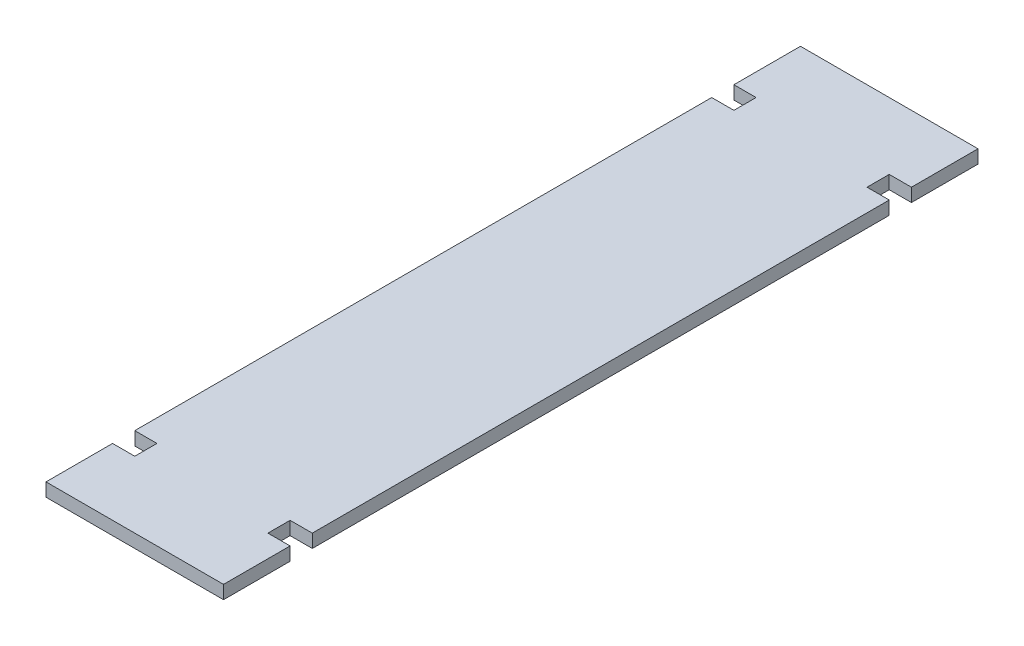
ISO-10303-21;
HEADER;
FILE_DESCRIPTION(('STEP AP214'),'2;1');
FILE_NAME('part.step','',(''),(''),'','','');
FILE_SCHEMA(('AUTOMOTIVE_DESIGN { 1 0 10303 214 1 1 1 1 }'));
ENDSEC;
DATA;
#1=APPLICATION_CONTEXT('core data for automotive mechanical design processes');
#2=APPLICATION_PROTOCOL_DEFINITION('international standard','automotive_design',2000,#1);
#3=PRODUCT_CONTEXT('',#1,'mechanical');
#4=PRODUCT('Part','Part','',(#3));
#5=PRODUCT_RELATED_PRODUCT_CATEGORY('part','',(#4));
#6=PRODUCT_DEFINITION_FORMATION('','',#4);
#7=PRODUCT_DEFINITION_CONTEXT('part definition',#1,'design');
#8=PRODUCT_DEFINITION('design','',#6,#7);
#9=PRODUCT_DEFINITION_SHAPE('','',#8);
#10=(LENGTH_UNIT() NAMED_UNIT(*) SI_UNIT(.MILLI.,.METRE.));
#11=(NAMED_UNIT(*) PLANE_ANGLE_UNIT() SI_UNIT($,.RADIAN.));
#12=(NAMED_UNIT(*) SI_UNIT($,.STERADIAN.) SOLID_ANGLE_UNIT());
#13=UNCERTAINTY_MEASURE_WITH_UNIT(LENGTH_MEASURE(1.E-05),#10,'distance_accuracy_value','');
#14=(GEOMETRIC_REPRESENTATION_CONTEXT(3) GLOBAL_UNCERTAINTY_ASSIGNED_CONTEXT((#13)) GLOBAL_UNIT_ASSIGNED_CONTEXT((#10,
#11,#12)) REPRESENTATION_CONTEXT('',''));
#15=CARTESIAN_POINT('',(0.,0.,0.));
#16=DIRECTION('',(0.,0.,1.));
#17=DIRECTION('',(1.,0.,0.));
#18=AXIS2_PLACEMENT_3D('',#15,#16,#17);
#19=CARTESIAN_POINT('',(0.,3.,0.));
#20=DIRECTION('',(1.,0.,0.));
#21=DIRECTION('',(0.,0.,-1.));
#22=AXIS2_PLACEMENT_3D('',#19,#20,#21);
#23=PLANE('',#22);
#24=DIRECTION('',(0.,-1.,0.));
#25=VECTOR('',#24,1.);
#26=CARTESIAN_POINT('',(0.,10.,-15.));
#27=LINE('',#26,#25);
#28=CARTESIAN_POINT('',(0.,3.,-15.));
#29=VERTEX_POINT('',#28);
#30=CARTESIAN_POINT('',(0.,0.,-15.));
#31=VERTEX_POINT('',#30);
#32=EDGE_CURVE('E199',#29,#31,#27,.T.);
#33=ORIENTED_EDGE('',*,*,#32,.T.);
#34=DIRECTION('',(0.,0.,1.));
#35=VECTOR('',#34,1.);
#36=CARTESIAN_POINT('',(0.,0.,0.));
#37=LINE('',#36,#35);
#38=CARTESIAN_POINT('',(0.,0.,0.));
#39=VERTEX_POINT('',#38);
#40=EDGE_CURVE('E229',#31,#39,#37,.T.);
#41=ORIENTED_EDGE('',*,*,#40,.T.);
#42=DIRECTION('',(0.,-1.,0.));
#43=VECTOR('',#42,1.);
#44=CARTESIAN_POINT('',(0.,3.,0.));
#45=LINE('',#44,#43);
#46=CARTESIAN_POINT('',(0.,3.,0.));
#47=VERTEX_POINT('',#46);
#48=EDGE_CURVE('E11',#47,#39,#45,.T.);
#49=ORIENTED_EDGE('',*,*,#48,.F.);
#50=DIRECTION('',(0.,0.,1.));
#51=VECTOR('',#50,1.);
#52=CARTESIAN_POINT('',(0.,3.,0.));
#53=LINE('',#52,#51);
#54=EDGE_CURVE('E211',#29,#47,#53,.T.);
#55=ORIENTED_EDGE('',*,*,#54,.F.);
#56=EDGE_LOOP('',(#33,#41,#49,#55));
#57=FACE_BOUND('',#56,.T.);
#58=ADVANCED_FACE('F39',(#57),#23,.F.);
#59=DIRECTION('',(0.,-1.,0.));
#60=VECTOR('',#59,1.);
#61=CARTESIAN_POINT('',(0.,10.,-20.));
#62=LINE('',#61,#60);
#63=CARTESIAN_POINT('',(0.,3.,-20.));
#64=VERTEX_POINT('',#63);
#65=CARTESIAN_POINT('',(0.,0.,-20.));
#66=VERTEX_POINT('',#65);
#67=EDGE_CURVE('E343',#64,#66,#62,.T.);
#68=ORIENTED_EDGE('',*,*,#67,.F.);
#69=CARTESIAN_POINT('',(0.,3.,-150.));
#70=VERTEX_POINT('',#69);
#71=EDGE_CURVE('E247',#70,#64,#53,.T.);
#72=ORIENTED_EDGE('',*,*,#71,.F.);
#73=DIRECTION('',(0.,-1.,0.));
#74=VECTOR('',#73,1.);
#75=CARTESIAN_POINT('',(0.,10.,-150.));
#76=LINE('',#75,#74);
#77=CARTESIAN_POINT('',(0.,0.,-150.));
#78=VERTEX_POINT('',#77);
#79=EDGE_CURVE('E291',#70,#78,#76,.T.);
#80=ORIENTED_EDGE('',*,*,#79,.T.);
#81=EDGE_CURVE('E227',#78,#66,#37,.T.);
#82=ORIENTED_EDGE('',*,*,#81,.T.);
#83=EDGE_LOOP('',(#68,#72,#80,#82));
#84=FACE_BOUND('',#83,.T.);
#85=ADVANCED_FACE('F423',(#84),#23,.F.);
#86=CARTESIAN_POINT('',(0.,0.,-170.));
#87=VERTEX_POINT('',#86);
#88=CARTESIAN_POINT('',(0.,0.,-155.));
#89=VERTEX_POINT('',#88);
#90=EDGE_CURVE('E223',#87,#89,#37,.T.);
#91=ORIENTED_EDGE('',*,*,#90,.T.);
#92=DIRECTION('',(0.,-1.,0.));
#93=VECTOR('',#92,1.);
#94=CARTESIAN_POINT('',(0.,10.,-155.));
#95=LINE('',#94,#93);
#96=CARTESIAN_POINT('',(0.,3.,-155.));
#97=VERTEX_POINT('',#96);
#98=EDGE_CURVE('E288',#97,#89,#95,.T.);
#99=ORIENTED_EDGE('',*,*,#98,.F.);
#100=CARTESIAN_POINT('',(0.,3.,-170.));
#101=VERTEX_POINT('',#100);
#102=EDGE_CURVE('E243',#101,#97,#53,.T.);
#103=ORIENTED_EDGE('',*,*,#102,.F.);
#104=DIRECTION('',(0.,-1.,0.));
#105=VECTOR('',#104,1.);
#106=CARTESIAN_POINT('',(0.,3.,-170.));
#107=LINE('',#106,#105);
#108=EDGE_CURVE('E234',#101,#87,#107,.T.);
#109=ORIENTED_EDGE('',*,*,#108,.T.);
#110=EDGE_LOOP('',(#91,#99,#103,#109));
#111=FACE_BOUND('',#110,.T.);
#112=ADVANCED_FACE('F406',(#111),#23,.F.);
#113=CARTESIAN_POINT('',(40.,3.,0.));
#114=DIRECTION('',(-1.,0.,0.));
#115=DIRECTION('',(0.,0.,1.));
#116=AXIS2_PLACEMENT_3D('',#113,#114,#115);
#117=PLANE('',#116);
#118=DIRECTION('',(0.,-1.,0.));
#119=VECTOR('',#118,1.);
#120=CARTESIAN_POINT('',(39.9999999999999,10.,-150.));
#121=LINE('',#120,#119);
#122=CARTESIAN_POINT('',(39.9999999999999,3.,-150.));
#123=VERTEX_POINT('',#122);
#124=CARTESIAN_POINT('',(39.9999999999999,0.,-150.));
#125=VERTEX_POINT('',#124);
#126=EDGE_CURVE('E315',#123,#125,#121,.T.);
#127=ORIENTED_EDGE('',*,*,#126,.F.);
#128=DIRECTION('',(0.,0.,-1.));
#129=VECTOR('',#128,1.);
#130=CARTESIAN_POINT('',(40.,3.,0.));
#131=LINE('',#130,#129);
#132=CARTESIAN_POINT('',(40.,3.,-20.));
#133=VERTEX_POINT('',#132);
#134=EDGE_CURVE('E238',#133,#123,#131,.T.);
#135=ORIENTED_EDGE('',*,*,#134,.F.);
#136=DIRECTION('',(0.,-1.,0.));
#137=VECTOR('',#136,1.);
#138=CARTESIAN_POINT('',(40.,10.,-20.));
#139=LINE('',#138,#137);
#140=CARTESIAN_POINT('',(40.,0.,-20.));
#141=VERTEX_POINT('',#140);
#142=EDGE_CURVE('E186',#133,#141,#139,.T.);
#143=ORIENTED_EDGE('',*,*,#142,.T.);
#144=DIRECTION('',(0.,0.,-1.));
#145=VECTOR('',#144,1.);
#146=CARTESIAN_POINT('',(40.,0.,0.));
#147=LINE('',#146,#145);
#148=EDGE_CURVE('E206',#141,#125,#147,.T.);
#149=ORIENTED_EDGE('',*,*,#148,.T.);
#150=EDGE_LOOP('',(#127,#135,#143,#149));
#151=FACE_BOUND('',#150,.T.);
#152=ADVANCED_FACE('F376',(#151),#117,.F.);
#153=DIRECTION('',(0.,-1.,0.));
#154=VECTOR('',#153,1.);
#155=CARTESIAN_POINT('',(40.,10.,-155.));
#156=LINE('',#155,#154);
#157=CARTESIAN_POINT('',(40.,3.,-155.));
#158=VERTEX_POINT('',#157);
#159=CARTESIAN_POINT('',(40.,0.,-155.));
#160=VERTEX_POINT('',#159);
#161=EDGE_CURVE('E318',#158,#160,#156,.T.);
#162=ORIENTED_EDGE('',*,*,#161,.T.);
#163=CARTESIAN_POINT('',(40.,0.,-170.));
#164=VERTEX_POINT('',#163);
#165=EDGE_CURVE('E208',#160,#164,#147,.T.);
#166=ORIENTED_EDGE('',*,*,#165,.T.);
#167=DIRECTION('',(0.,-1.,0.));
#168=VECTOR('',#167,1.);
#169=CARTESIAN_POINT('',(40.,3.,-170.));
#170=LINE('',#169,#168);
#171=CARTESIAN_POINT('',(40.,3.,-170.));
#172=VERTEX_POINT('',#171);
#173=EDGE_CURVE('E392',#172,#164,#170,.T.);
#174=ORIENTED_EDGE('',*,*,#173,.F.);
#175=EDGE_CURVE('E239',#158,#172,#131,.T.);
#176=ORIENTED_EDGE('',*,*,#175,.F.);
#177=EDGE_LOOP('',(#162,#166,#174,#176));
#178=FACE_BOUND('',#177,.T.);
#179=ADVANCED_FACE('F393',(#178),#117,.F.);
#180=CARTESIAN_POINT('',(40.,0.,0.));
#181=VERTEX_POINT('',#180);
#182=CARTESIAN_POINT('',(40.,0.,-15.));
#183=VERTEX_POINT('',#182);
#184=EDGE_CURVE('E193',#181,#183,#147,.T.);
#185=ORIENTED_EDGE('',*,*,#184,.T.);
#186=DIRECTION('',(0.,-1.,0.));
#187=VECTOR('',#186,1.);
#188=CARTESIAN_POINT('',(40.,10.,-15.));
#189=LINE('',#188,#187);
#190=CARTESIAN_POINT('',(40.,3.,-15.));
#191=VERTEX_POINT('',#190);
#192=EDGE_CURVE('E176',#191,#183,#189,.T.);
#193=ORIENTED_EDGE('',*,*,#192,.F.);
#194=CARTESIAN_POINT('',(40.,3.,0.));
#195=VERTEX_POINT('',#194);
#196=EDGE_CURVE('E235',#195,#191,#131,.T.);
#197=ORIENTED_EDGE('',*,*,#196,.F.);
#198=DIRECTION('',(0.,-1.,0.));
#199=VECTOR('',#198,1.);
#200=CARTESIAN_POINT('',(40.,3.,0.));
#201=LINE('',#200,#199);
#202=EDGE_CURVE('E47',#195,#181,#201,.T.);
#203=ORIENTED_EDGE('',*,*,#202,.T.);
#204=EDGE_LOOP('',(#185,#193,#197,#203));
#205=FACE_BOUND('',#204,.T.);
#206=ADVANCED_FACE('F202',(#205),#117,.F.);
#207=CARTESIAN_POINT('',(0.,3.,0.));
#208=DIRECTION('',(0.,-1.,0.));
#209=DIRECTION('',(0.,0.,-1.));
#210=AXIS2_PLACEMENT_3D('',#207,#208,#209);
#211=PLANE('',#210);
#212=DIRECTION('',(1.,0.,0.));
#213=VECTOR('',#212,1.);
#214=CARTESIAN_POINT('',(0.,3.,-150.));
#215=LINE('',#214,#213);
#216=CARTESIAN_POINT('',(35.,3.,-150.));
#217=VERTEX_POINT('',#216);
#218=EDGE_CURVE('E251',#217,#123,#215,.T.);
#219=ORIENTED_EDGE('',*,*,#218,.F.);
#220=DIRECTION('',(0.,0.,1.));
#221=VECTOR('',#220,1.);
#222=CARTESIAN_POINT('',(35.,3.,0.));
#223=LINE('',#222,#221);
#224=CARTESIAN_POINT('',(35.,3.,-155.));
#225=VERTEX_POINT('',#224);
#226=EDGE_CURVE('E248',#225,#217,#223,.T.);
#227=ORIENTED_EDGE('',*,*,#226,.F.);
#228=DIRECTION('',(-1.,0.,0.));
#229=VECTOR('',#228,1.);
#230=CARTESIAN_POINT('',(0.,3.,-155.));
#231=LINE('',#230,#229);
#232=EDGE_CURVE('E254',#158,#225,#231,.T.);
#233=ORIENTED_EDGE('',*,*,#232,.F.);
#234=ORIENTED_EDGE('',*,*,#175,.T.);
#235=DIRECTION('',(-1.,0.,0.));
#236=VECTOR('',#235,1.);
#237=CARTESIAN_POINT('',(0.,3.,-170.));
#238=LINE('',#237,#236);
#239=EDGE_CURVE('E231',#172,#101,#238,.T.);
#240=ORIENTED_EDGE('',*,*,#239,.T.);
#241=ORIENTED_EDGE('',*,*,#102,.T.);
#242=DIRECTION('',(1.,0.,0.));
#243=VECTOR('',#242,1.);
#244=CARTESIAN_POINT('',(0.,3.,-155.));
#245=LINE('',#244,#243);
#246=CARTESIAN_POINT('',(5.,3.,-155.));
#247=VERTEX_POINT('',#246);
#248=EDGE_CURVE('E276',#97,#247,#245,.T.);
#249=ORIENTED_EDGE('',*,*,#248,.T.);
#250=DIRECTION('',(0.,0.,1.));
#251=VECTOR('',#250,1.);
#252=CARTESIAN_POINT('',(5.00000000000003,3.,0.));
#253=LINE('',#252,#251);
#254=CARTESIAN_POINT('',(5.,3.,-150.));
#255=VERTEX_POINT('',#254);
#256=EDGE_CURVE('E284',#247,#255,#253,.T.);
#257=ORIENTED_EDGE('',*,*,#256,.T.);
#258=DIRECTION('',(-1.,0.,0.));
#259=VECTOR('',#258,1.);
#260=CARTESIAN_POINT('',(0.,3.,-150.));
#261=LINE('',#260,#259);
#262=EDGE_CURVE('E280',#255,#70,#261,.T.);
#263=ORIENTED_EDGE('',*,*,#262,.T.);
#264=ORIENTED_EDGE('',*,*,#71,.T.);
#265=DIRECTION('',(-1.,0.,0.));
#266=VECTOR('',#265,1.);
#267=CARTESIAN_POINT('',(0.,3.,-20.));
#268=LINE('',#267,#266);
#269=CARTESIAN_POINT('',(5.00000000000004,3.,-20.));
#270=VERTEX_POINT('',#269);
#271=EDGE_CURVE('E263',#270,#64,#268,.T.);
#272=ORIENTED_EDGE('',*,*,#271,.F.);
#273=DIRECTION('',(0.,0.,-1.));
#274=VECTOR('',#273,1.);
#275=CARTESIAN_POINT('',(5.00000000000004,3.,0.));
#276=LINE('',#275,#274);
#277=CARTESIAN_POINT('',(5.00000000000004,3.,-15.));
#278=VERTEX_POINT('',#277);
#279=EDGE_CURVE('E260',#278,#270,#276,.T.);
#280=ORIENTED_EDGE('',*,*,#279,.F.);
#281=DIRECTION('',(1.,0.,0.));
#282=VECTOR('',#281,1.);
#283=CARTESIAN_POINT('',(0.,3.,-15.));
#284=LINE('',#283,#282);
#285=EDGE_CURVE('E257',#29,#278,#284,.T.);
#286=ORIENTED_EDGE('',*,*,#285,.F.);
#287=ORIENTED_EDGE('',*,*,#54,.T.);
#288=DIRECTION('',(1.,0.,0.));
#289=VECTOR('',#288,1.);
#290=CARTESIAN_POINT('',(0.,3.,0.));
#291=LINE('',#290,#289);
#292=EDGE_CURVE('E240',#47,#195,#291,.T.);
#293=ORIENTED_EDGE('',*,*,#292,.T.);
#294=ORIENTED_EDGE('',*,*,#196,.T.);
#295=DIRECTION('',(-1.,0.,0.));
#296=VECTOR('',#295,1.);
#297=CARTESIAN_POINT('',(0.,3.,-14.9999999999998));
#298=LINE('',#297,#296);
#299=CARTESIAN_POINT('',(35.,3.,-15.));
#300=VERTEX_POINT('',#299);
#301=EDGE_CURVE('E179',#191,#300,#298,.T.);
#302=ORIENTED_EDGE('',*,*,#301,.T.);
#303=DIRECTION('',(0.,0.,-1.));
#304=VECTOR('',#303,1.);
#305=CARTESIAN_POINT('',(35.,3.,0.));
#306=LINE('',#305,#304);
#307=CARTESIAN_POINT('',(35.,3.,-20.));
#308=VERTEX_POINT('',#307);
#309=EDGE_CURVE('E272',#300,#308,#306,.T.);
#310=ORIENTED_EDGE('',*,*,#309,.T.);
#311=DIRECTION('',(1.,0.,0.));
#312=VECTOR('',#311,1.);
#313=CARTESIAN_POINT('',(0.,3.,-20.));
#314=LINE('',#313,#312);
#315=EDGE_CURVE('E268',#308,#133,#314,.T.);
#316=ORIENTED_EDGE('',*,*,#315,.T.);
#317=ORIENTED_EDGE('',*,*,#134,.T.);
#318=EDGE_LOOP('',(#219,#227,#233,#234,#240,#241,#249,#257,#263,#264,#272,#280,#286,#287,#293,
#294,#302,#310,#316,#317));
#319=FACE_BOUND('',#318,.T.);
#320=ADVANCED_FACE('F384',(#319),#211,.F.);
#321=CARTESIAN_POINT('',(0.,0.,0.));
#322=DIRECTION('',(0.,-1.,0.));
#323=DIRECTION('',(0.,0.,-1.));
#324=AXIS2_PLACEMENT_3D('',#321,#322,#323);
#325=PLANE('',#324);
#326=DIRECTION('',(0.,0.,1.));
#327=VECTOR('',#326,1.);
#328=CARTESIAN_POINT('',(35.,0.,0.));
#329=LINE('',#328,#327);
#330=CARTESIAN_POINT('',(35.,0.,-155.));
#331=VERTEX_POINT('',#330);
#332=CARTESIAN_POINT('',(35.,0.,-150.));
#333=VERTEX_POINT('',#332);
#334=EDGE_CURVE('E54',#331,#333,#329,.T.);
#335=ORIENTED_EDGE('',*,*,#334,.T.);
#336=DIRECTION('',(1.,0.,0.));
#337=VECTOR('',#336,1.);
#338=CARTESIAN_POINT('',(0.,0.,-150.));
#339=LINE('',#338,#337);
#340=EDGE_CURVE('E328',#333,#125,#339,.T.);
#341=ORIENTED_EDGE('',*,*,#340,.T.);
#342=ORIENTED_EDGE('',*,*,#148,.F.);
#343=DIRECTION('',(1.,0.,0.));
#344=VECTOR('',#343,1.);
#345=CARTESIAN_POINT('',(0.,0.,-20.));
#346=LINE('',#345,#344);
#347=CARTESIAN_POINT('',(35.,0.,-20.));
#348=VERTEX_POINT('',#347);
#349=EDGE_CURVE('E198',#348,#141,#346,.T.);
#350=ORIENTED_EDGE('',*,*,#349,.F.);
#351=DIRECTION('',(0.,0.,-1.));
#352=VECTOR('',#351,1.);
#353=CARTESIAN_POINT('',(35.,0.,0.));
#354=LINE('',#353,#352);
#355=CARTESIAN_POINT('',(35.,0.,-15.));
#356=VERTEX_POINT('',#355);
#357=EDGE_CURVE('E196',#356,#348,#354,.T.);
#358=ORIENTED_EDGE('',*,*,#357,.F.);
#359=DIRECTION('',(-1.,0.,0.));
#360=VECTOR('',#359,1.);
#361=CARTESIAN_POINT('',(0.,0.,-14.9999999999998));
#362=LINE('',#361,#360);
#363=EDGE_CURVE('E62',#183,#356,#362,.T.);
#364=ORIENTED_EDGE('',*,*,#363,.F.);
#365=ORIENTED_EDGE('',*,*,#184,.F.);
#366=DIRECTION('',(1.,0.,0.));
#367=VECTOR('',#366,1.);
#368=CARTESIAN_POINT('',(0.,0.,0.));
#369=LINE('',#368,#367);
#370=EDGE_CURVE('E216',#39,#181,#369,.T.);
#371=ORIENTED_EDGE('',*,*,#370,.F.);
#372=ORIENTED_EDGE('',*,*,#40,.F.);
#373=DIRECTION('',(1.,0.,0.));
#374=VECTOR('',#373,1.);
#375=CARTESIAN_POINT('',(0.,0.,-15.));
#376=LINE('',#375,#374);
#377=CARTESIAN_POINT('',(5.00000000000004,0.,-15.));
#378=VERTEX_POINT('',#377);
#379=EDGE_CURVE('E314',#31,#378,#376,.T.);
#380=ORIENTED_EDGE('',*,*,#379,.T.);
#381=DIRECTION('',(0.,0.,-1.));
#382=VECTOR('',#381,1.);
#383=CARTESIAN_POINT('',(5.00000000000004,0.,0.));
#384=LINE('',#383,#382);
#385=CARTESIAN_POINT('',(5.00000000000004,0.,-20.));
#386=VERTEX_POINT('',#385);
#387=EDGE_CURVE('E350',#378,#386,#384,.T.);
#388=ORIENTED_EDGE('',*,*,#387,.T.);
#389=DIRECTION('',(-1.,0.,0.));
#390=VECTOR('',#389,1.);
#391=CARTESIAN_POINT('',(0.,0.,-20.));
#392=LINE('',#391,#390);
#393=EDGE_CURVE('E346',#386,#66,#392,.T.);
#394=ORIENTED_EDGE('',*,*,#393,.T.);
#395=ORIENTED_EDGE('',*,*,#81,.F.);
#396=DIRECTION('',(-1.,0.,0.));
#397=VECTOR('',#396,1.);
#398=CARTESIAN_POINT('',(0.,0.,-150.));
#399=LINE('',#398,#397);
#400=CARTESIAN_POINT('',(5.,0.,-150.));
#401=VERTEX_POINT('',#400);
#402=EDGE_CURVE('E306',#401,#78,#399,.T.);
#403=ORIENTED_EDGE('',*,*,#402,.F.);
#404=DIRECTION('',(0.,0.,1.));
#405=VECTOR('',#404,1.);
#406=CARTESIAN_POINT('',(5.00000000000003,0.,0.));
#407=LINE('',#406,#405);
#408=CARTESIAN_POINT('',(5.,0.,-155.));
#409=VERTEX_POINT('',#408);
#410=EDGE_CURVE('E302',#409,#401,#407,.T.);
#411=ORIENTED_EDGE('',*,*,#410,.F.);
#412=DIRECTION('',(1.,0.,0.));
#413=VECTOR('',#412,1.);
#414=CARTESIAN_POINT('',(0.,0.,-155.));
#415=LINE('',#414,#413);
#416=EDGE_CURVE('E185',#89,#409,#415,.T.);
#417=ORIENTED_EDGE('',*,*,#416,.F.);
#418=ORIENTED_EDGE('',*,*,#90,.F.);
#419=DIRECTION('',(-1.,0.,0.));
#420=VECTOR('',#419,1.);
#421=CARTESIAN_POINT('',(0.,0.,-170.));
#422=LINE('',#421,#420);
#423=EDGE_CURVE('E205',#164,#87,#422,.T.);
#424=ORIENTED_EDGE('',*,*,#423,.F.);
#425=ORIENTED_EDGE('',*,*,#165,.F.);
#426=DIRECTION('',(-1.,0.,0.));
#427=VECTOR('',#426,1.);
#428=CARTESIAN_POINT('',(0.,0.,-155.));
#429=LINE('',#428,#427);
#430=EDGE_CURVE('E324',#160,#331,#429,.T.);
#431=ORIENTED_EDGE('',*,*,#430,.T.);
#432=EDGE_LOOP('',(#335,#341,#342,#350,#358,#364,#365,#371,#372,#380,#388,#394,#395,#403,#411,
#417,#418,#424,#425,#431));
#433=FACE_BOUND('',#432,.T.);
#434=ADVANCED_FACE('F191',(#433),#325,.T.);
#435=CARTESIAN_POINT('',(0.,3.,0.));
#436=DIRECTION('',(0.,0.,-1.));
#437=DIRECTION('',(-1.,0.,0.));
#438=AXIS2_PLACEMENT_3D('',#435,#436,#437);
#439=PLANE('',#438);
#440=ORIENTED_EDGE('',*,*,#370,.T.);
#441=ORIENTED_EDGE('',*,*,#202,.F.);
#442=ORIENTED_EDGE('',*,*,#292,.F.);
#443=ORIENTED_EDGE('',*,*,#48,.T.);
#444=EDGE_LOOP('',(#440,#441,#442,#443));
#445=FACE_BOUND('',#444,.T.);
#446=ADVANCED_FACE('F434',(#445),#439,.F.);
#447=CARTESIAN_POINT('',(0.,3.,-170.));
#448=DIRECTION('',(0.,0.,1.));
#449=DIRECTION('',(1.,0.,0.));
#450=AXIS2_PLACEMENT_3D('',#447,#448,#449);
#451=PLANE('',#450);
#452=ORIENTED_EDGE('',*,*,#423,.T.);
#453=ORIENTED_EDGE('',*,*,#108,.F.);
#454=ORIENTED_EDGE('',*,*,#239,.F.);
#455=ORIENTED_EDGE('',*,*,#173,.T.);
#456=EDGE_LOOP('',(#452,#453,#454,#455));
#457=FACE_BOUND('',#456,.T.);
#458=ADVANCED_FACE('F398',(#457),#451,.F.);
#459=CARTESIAN_POINT('',(0.,10.,-155.));
#460=DIRECTION('',(0.,0.,-1.));
#461=DIRECTION('',(-1.,0.,0.));
#462=AXIS2_PLACEMENT_3D('',#459,#460,#461);
#463=PLANE('',#462);
#464=ORIENTED_EDGE('',*,*,#98,.T.);
#465=ORIENTED_EDGE('',*,*,#416,.T.);
#466=DIRECTION('',(0.,-1.,0.));
#467=VECTOR('',#466,1.);
#468=CARTESIAN_POINT('',(5.,10.,-155.));
#469=LINE('',#468,#467);
#470=EDGE_CURVE('E298',#247,#409,#469,.T.);
#471=ORIENTED_EDGE('',*,*,#470,.F.);
#472=ORIENTED_EDGE('',*,*,#248,.F.);
#473=EDGE_LOOP('',(#464,#465,#471,#472));
#474=FACE_BOUND('',#473,.T.);
#475=ADVANCED_FACE('F409',(#474),#463,.F.);
#476=CARTESIAN_POINT('',(0.,10.,-150.));
#477=DIRECTION('',(0.,0.,1.));
#478=DIRECTION('',(1.,0.,0.));
#479=AXIS2_PLACEMENT_3D('',#476,#477,#478);
#480=PLANE('',#479);
#481=DIRECTION('',(0.,-1.,0.));
#482=VECTOR('',#481,1.);
#483=CARTESIAN_POINT('',(5.,10.,-150.));
#484=LINE('',#483,#482);
#485=EDGE_CURVE('E295',#255,#401,#484,.T.);
#486=ORIENTED_EDGE('',*,*,#485,.T.);
#487=ORIENTED_EDGE('',*,*,#402,.T.);
#488=ORIENTED_EDGE('',*,*,#79,.F.);
#489=ORIENTED_EDGE('',*,*,#262,.F.);
#490=EDGE_LOOP('',(#486,#487,#488,#489));
#491=FACE_BOUND('',#490,.T.);
#492=ADVANCED_FACE('F419',(#491),#480,.F.);
#493=CARTESIAN_POINT('',(5.00000000000003,10.,0.));
#494=DIRECTION('',(1.,0.,0.));
#495=DIRECTION('',(0.,0.,-1.));
#496=AXIS2_PLACEMENT_3D('',#493,#494,#495);
#497=PLANE('',#496);
#498=ORIENTED_EDGE('',*,*,#470,.T.);
#499=ORIENTED_EDGE('',*,*,#410,.T.);
#500=ORIENTED_EDGE('',*,*,#485,.F.);
#501=ORIENTED_EDGE('',*,*,#256,.F.);
#502=EDGE_LOOP('',(#498,#499,#500,#501));
#503=FACE_BOUND('',#502,.T.);
#504=ADVANCED_FACE('F413',(#503),#497,.F.);
#505=CARTESIAN_POINT('',(0.,10.,-14.9999999999998));
#506=DIRECTION('',(0.,0.,1.));
#507=DIRECTION('',(1.,0.,0.));
#508=AXIS2_PLACEMENT_3D('',#505,#506,#507);
#509=PLANE('',#508);
#510=ORIENTED_EDGE('',*,*,#192,.T.);
#511=ORIENTED_EDGE('',*,*,#363,.T.);
#512=DIRECTION('',(0.,-1.,0.));
#513=VECTOR('',#512,1.);
#514=CARTESIAN_POINT('',(35.,10.,-15.));
#515=LINE('',#514,#513);
#516=EDGE_CURVE('E363',#300,#356,#515,.T.);
#517=ORIENTED_EDGE('',*,*,#516,.F.);
#518=ORIENTED_EDGE('',*,*,#301,.F.);
#519=EDGE_LOOP('',(#510,#511,#517,#518));
#520=FACE_BOUND('',#519,.T.);
#521=ADVANCED_FACE('F177',(#520),#509,.F.);
#522=CARTESIAN_POINT('',(0.,10.,-20.));
#523=DIRECTION('',(0.,0.,-1.));
#524=DIRECTION('',(-1.,0.,0.));
#525=AXIS2_PLACEMENT_3D('',#522,#523,#524);
#526=PLANE('',#525);
#527=DIRECTION('',(0.,-1.,0.));
#528=VECTOR('',#527,1.);
#529=CARTESIAN_POINT('',(35.,10.,-20.));
#530=LINE('',#529,#528);
#531=EDGE_CURVE('E360',#308,#348,#530,.T.);
#532=ORIENTED_EDGE('',*,*,#531,.T.);
#533=ORIENTED_EDGE('',*,*,#349,.T.);
#534=ORIENTED_EDGE('',*,*,#142,.F.);
#535=ORIENTED_EDGE('',*,*,#315,.F.);
#536=EDGE_LOOP('',(#532,#533,#534,#535));
#537=FACE_BOUND('',#536,.T.);
#538=ADVANCED_FACE('F370',(#537),#526,.F.);
#539=CARTESIAN_POINT('',(35.,10.,0.));
#540=DIRECTION('',(-1.,0.,0.));
#541=DIRECTION('',(0.,0.,1.));
#542=AXIS2_PLACEMENT_3D('',#539,#540,#541);
#543=PLANE('',#542);
#544=ORIENTED_EDGE('',*,*,#516,.T.);
#545=ORIENTED_EDGE('',*,*,#357,.T.);
#546=ORIENTED_EDGE('',*,*,#531,.F.);
#547=ORIENTED_EDGE('',*,*,#309,.F.);
#548=EDGE_LOOP('',(#544,#545,#546,#547));
#549=FACE_BOUND('',#548,.T.);
#550=ADVANCED_FACE('F534',(#549),#543,.F.);
#551=CARTESIAN_POINT('',(0.,10.,-15.));
#552=DIRECTION('',(0.,0.,-1.));
#553=DIRECTION('',(-1.,0.,0.));
#554=AXIS2_PLACEMENT_3D('',#551,#552,#553);
#555=PLANE('',#554);
#556=ORIENTED_EDGE('',*,*,#285,.T.);
#557=DIRECTION('',(0.,-1.,0.));
#558=VECTOR('',#557,1.);
#559=CARTESIAN_POINT('',(5.00000000000004,10.,-15.));
#560=LINE('',#559,#558);
#561=EDGE_CURVE('E337',#278,#378,#560,.T.);
#562=ORIENTED_EDGE('',*,*,#561,.T.);
#563=ORIENTED_EDGE('',*,*,#379,.F.);
#564=ORIENTED_EDGE('',*,*,#32,.F.);
#565=EDGE_LOOP('',(#556,#562,#563,#564));
#566=FACE_BOUND('',#565,.T.);
#567=ADVANCED_FACE('F440',(#566),#555,.T.);
#568=CARTESIAN_POINT('',(5.00000000000004,10.,0.));
#569=DIRECTION('',(-1.,0.,0.));
#570=DIRECTION('',(0.,0.,1.));
#571=AXIS2_PLACEMENT_3D('',#568,#569,#570);
#572=PLANE('',#571);
#573=ORIENTED_EDGE('',*,*,#279,.T.);
#574=DIRECTION('',(0.,-1.,0.));
#575=VECTOR('',#574,1.);
#576=CARTESIAN_POINT('',(5.00000000000004,10.,-20.));
#577=LINE('',#576,#575);
#578=EDGE_CURVE('E340',#270,#386,#577,.T.);
#579=ORIENTED_EDGE('',*,*,#578,.T.);
#580=ORIENTED_EDGE('',*,*,#387,.F.);
#581=ORIENTED_EDGE('',*,*,#561,.F.);
#582=EDGE_LOOP('',(#573,#579,#580,#581));
#583=FACE_BOUND('',#582,.T.);
#584=ADVANCED_FACE('F443',(#583),#572,.T.);
#585=CARTESIAN_POINT('',(0.,10.,-20.));
#586=DIRECTION('',(0.,0.,1.));
#587=DIRECTION('',(1.,0.,0.));
#588=AXIS2_PLACEMENT_3D('',#585,#586,#587);
#589=PLANE('',#588);
#590=ORIENTED_EDGE('',*,*,#271,.T.);
#591=ORIENTED_EDGE('',*,*,#67,.T.);
#592=ORIENTED_EDGE('',*,*,#393,.F.);
#593=ORIENTED_EDGE('',*,*,#578,.F.);
#594=EDGE_LOOP('',(#590,#591,#592,#593));
#595=FACE_BOUND('',#594,.T.);
#596=ADVANCED_FACE('F447',(#595),#589,.T.);
#597=CARTESIAN_POINT('',(35.,10.,0.));
#598=DIRECTION('',(1.,0.,0.));
#599=DIRECTION('',(0.,0.,-1.));
#600=AXIS2_PLACEMENT_3D('',#597,#598,#599);
#601=PLANE('',#600);
#602=ORIENTED_EDGE('',*,*,#226,.T.);
#603=DIRECTION('',(0.,-1.,0.));
#604=VECTOR('',#603,1.);
#605=CARTESIAN_POINT('',(35.,10.,-150.));
#606=LINE('',#605,#604);
#607=EDGE_CURVE('E311',#217,#333,#606,.T.);
#608=ORIENTED_EDGE('',*,*,#607,.T.);
#609=ORIENTED_EDGE('',*,*,#334,.F.);
#610=DIRECTION('',(0.,-1.,0.));
#611=VECTOR('',#610,1.);
#612=CARTESIAN_POINT('',(35.,10.,-155.));
#613=LINE('',#612,#611);
#614=EDGE_CURVE('E321',#225,#331,#613,.T.);
#615=ORIENTED_EDGE('',*,*,#614,.F.);
#616=EDGE_LOOP('',(#602,#608,#609,#615));
#617=FACE_BOUND('',#616,.T.);
#618=ADVANCED_FACE('F449',(#617),#601,.T.);
#619=CARTESIAN_POINT('',(0.,10.,-150.));
#620=DIRECTION('',(0.,0.,-1.));
#621=DIRECTION('',(-1.,0.,0.));
#622=AXIS2_PLACEMENT_3D('',#619,#620,#621);
#623=PLANE('',#622);
#624=ORIENTED_EDGE('',*,*,#218,.T.);
#625=ORIENTED_EDGE('',*,*,#126,.T.);
#626=ORIENTED_EDGE('',*,*,#340,.F.);
#627=ORIENTED_EDGE('',*,*,#607,.F.);
#628=EDGE_LOOP('',(#624,#625,#626,#627));
#629=FACE_BOUND('',#628,.T.);
#630=ADVANCED_FACE('F381',(#629),#623,.T.);
#631=CARTESIAN_POINT('',(0.,10.,-155.));
#632=DIRECTION('',(0.,0.,1.));
#633=DIRECTION('',(1.,0.,0.));
#634=AXIS2_PLACEMENT_3D('',#631,#632,#633);
#635=PLANE('',#634);
#636=ORIENTED_EDGE('',*,*,#232,.T.);
#637=ORIENTED_EDGE('',*,*,#614,.T.);
#638=ORIENTED_EDGE('',*,*,#430,.F.);
#639=ORIENTED_EDGE('',*,*,#161,.F.);
#640=EDGE_LOOP('',(#636,#637,#638,#639));
#641=FACE_BOUND('',#640,.T.);
#642=ADVANCED_FACE('F576',(#641),#635,.T.);
#643=CLOSED_SHELL('',(#58,#85,#112,#152,#179,#206,#320,#434,#446,#458,#475,#492,#504,#521,#538,
#550,#567,#584,#596,#618,#630,#642));
#644=MANIFOLD_SOLID_BREP('B2',#643);
#645=ADVANCED_BREP_SHAPE_REPRESENTATION('',(#18,#644),#14);
#646=SHAPE_DEFINITION_REPRESENTATION(#9,#645);
ENDSEC;
END-ISO-10303-21;
